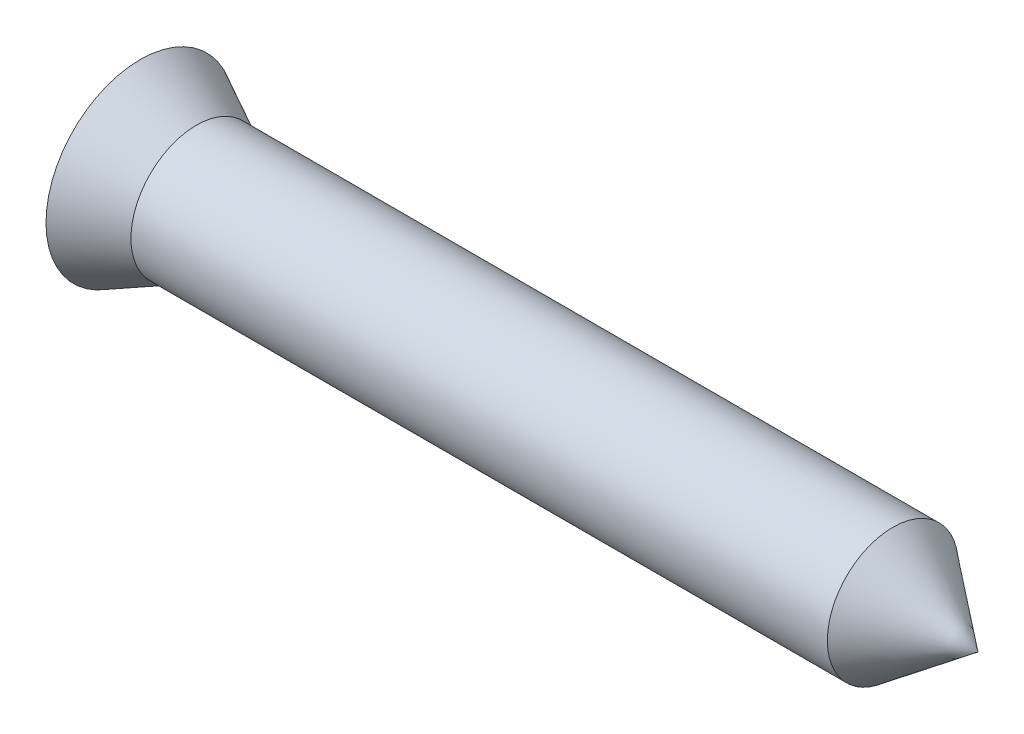
ISO-10303-21;
HEADER;
FILE_DESCRIPTION(('STEP AP214'),'2;1');
FILE_NAME('part.step','',(''),(''),'','','');
FILE_SCHEMA(('AUTOMOTIVE_DESIGN { 1 0 10303 214 1 1 1 1 }'));
ENDSEC;
DATA;
#1=APPLICATION_CONTEXT('core data for automotive mechanical design processes');
#2=APPLICATION_PROTOCOL_DEFINITION('international standard','automotive_design',2000,#1);
#3=PRODUCT_CONTEXT('',#1,'mechanical');
#4=PRODUCT('Part','Part','',(#3));
#5=PRODUCT_RELATED_PRODUCT_CATEGORY('part','',(#4));
#6=PRODUCT_DEFINITION_FORMATION('','',#4);
#7=PRODUCT_DEFINITION_CONTEXT('part definition',#1,'design');
#8=PRODUCT_DEFINITION('design','',#6,#7);
#9=PRODUCT_DEFINITION_SHAPE('','',#8);
#10=(LENGTH_UNIT() NAMED_UNIT(*) SI_UNIT(.MILLI.,.METRE.));
#11=(NAMED_UNIT(*) PLANE_ANGLE_UNIT() SI_UNIT($,.RADIAN.));
#12=(NAMED_UNIT(*) SI_UNIT($,.STERADIAN.) SOLID_ANGLE_UNIT());
#13=UNCERTAINTY_MEASURE_WITH_UNIT(LENGTH_MEASURE(1.E-05),#10,'distance_accuracy_value','');
#14=(GEOMETRIC_REPRESENTATION_CONTEXT(3) GLOBAL_UNCERTAINTY_ASSIGNED_CONTEXT((#13)) GLOBAL_UNIT_ASSIGNED_CONTEXT((#10,
#11,#12)) REPRESENTATION_CONTEXT('',''));
#15=CARTESIAN_POINT('',(0.,0.,0.));
#16=DIRECTION('',(0.,0.,1.));
#17=DIRECTION('',(1.,0.,0.));
#18=AXIS2_PLACEMENT_3D('',#15,#16,#17);
#19=CARTESIAN_POINT('',(0.,0.,0.));
#20=DIRECTION('',(-1.,0.,0.));
#21=DIRECTION('',(0.,0.,1.));
#22=AXIS2_PLACEMENT_3D('',#19,#20,#21);
#23=PLANE('',#22);
#24=CARTESIAN_POINT('',(0.,0.,0.));
#25=DIRECTION('',(1.,0.,0.));
#26=DIRECTION('',(0.,0.,-1.));
#27=AXIS2_PLACEMENT_3D('',#24,#25,#26);
#28=CIRCLE('',#27,2.8575);
#29=CARTESIAN_POINT('',(0.,0.,-2.8575));
#30=VERTEX_POINT('',#29);
#31=EDGE_CURVE('E11',#30,#30,#28,.T.);
#32=ORIENTED_EDGE('',*,*,#31,.F.);
#33=EDGE_LOOP('',(#32));
#34=FACE_BOUND('',#33,.T.);
#35=DIRECTION('',(0.,1.,0.));
#36=VECTOR('',#35,1.);
#37=CARTESIAN_POINT('',(0.,-1.90070961649651,-0.510211375025338));
#38=LINE('',#37,#36);
#39=CARTESIAN_POINT('',(0.,-1.90070961649651,-0.510211375025338));
#40=VERTEX_POINT('',#39);
#41=CARTESIAN_POINT('',(0.,-0.526132958545478,-0.510211375025338));
#42=VERTEX_POINT('',#41);
#43=EDGE_CURVE('E210',#40,#42,#38,.T.);
#44=ORIENTED_EDGE('',*,*,#43,.T.);
#45=CARTESIAN_POINT('',(0.,-0.526132958545476,-0.764211375025338));
#46=DIRECTION('',(-1.,0.,0.));
#47=DIRECTION('',(0.,0.,1.));
#48=AXIS2_PLACEMENT_3D('',#45,#46,#47);
#49=CIRCLE('',#48,0.254);
#50=CARTESIAN_POINT('',(0.,-0.272132958545476,-0.76421137502534));
#51=VERTEX_POINT('',#50);
#52=EDGE_CURVE('E48',#42,#51,#49,.T.);
#53=ORIENTED_EDGE('',*,*,#52,.T.);
#54=DIRECTION('',(0.,0.,-1.));
#55=VECTOR('',#54,1.);
#56=CARTESIAN_POINT('',(0.,-0.272132958545476,-0.76421137502534));
#57=LINE('',#56,#55);
#58=CARTESIAN_POINT('',(0.,-0.272132958545476,-1.78737372349218));
#59=VERTEX_POINT('',#58);
#60=EDGE_CURVE('E214',#51,#59,#57,.T.);
#61=ORIENTED_EDGE('',*,*,#60,.T.);
#62=CARTESIAN_POINT('',(0.,-0.018132958545476,-1.78737372349218));
#63=DIRECTION('',(1.,0.,0.));
#64=DIRECTION('',(0.,0.,-1.));
#65=AXIS2_PLACEMENT_3D('',#62,#63,#64);
#66=CIRCLE('',#65,0.254);
#67=CARTESIAN_POINT('',(0.,-0.0181329585454742,-2.04137372349218));
#68=VERTEX_POINT('',#67);
#69=EDGE_CURVE('E573',#59,#68,#66,.T.);
#70=ORIENTED_EDGE('',*,*,#69,.T.);
#71=DIRECTION('',(0.,1.,0.));
#72=VECTOR('',#71,1.);
#73=CARTESIAN_POINT('',(0.,-0.0181329585454742,-2.04137372349218));
#74=LINE('',#73,#72);
#75=CARTESIAN_POINT('',(0.,0.310567778321648,-2.04137372349218));
#76=VERTEX_POINT('',#75);
#77=EDGE_CURVE('E575',#68,#76,#74,.T.);
#78=ORIENTED_EDGE('',*,*,#77,.T.);
#79=CARTESIAN_POINT('',(0.,0.31056777832165,-1.78737372349218));
#80=DIRECTION('',(1.,0.,0.));
#81=DIRECTION('',(0.,0.,1.));
#82=AXIS2_PLACEMENT_3D('',#79,#80,#81);
#83=CIRCLE('',#82,0.254);
#84=CARTESIAN_POINT('',(0.,0.56456777832165,-1.78737372349218));
#85=VERTEX_POINT('',#84);
#86=EDGE_CURVE('E579',#76,#85,#83,.T.);
#87=ORIENTED_EDGE('',*,*,#86,.T.);
#88=DIRECTION('',(0.,0.,1.));
#89=VECTOR('',#88,1.);
#90=CARTESIAN_POINT('',(0.,0.56456777832165,-1.78737372349218));
#91=LINE('',#90,#89);
#92=CARTESIAN_POINT('',(0.,0.56456777832165,-0.680541301338626));
#93=VERTEX_POINT('',#92);
#94=EDGE_CURVE('E586',#85,#93,#91,.T.);
#95=ORIENTED_EDGE('',*,*,#94,.T.);
#96=CARTESIAN_POINT('',(0.,0.81856777832165,-0.680541301338624));
#97=DIRECTION('',(-1.,0.,0.));
#98=DIRECTION('',(0.,0.,1.));
#99=AXIS2_PLACEMENT_3D('',#96,#97,#98);
#100=CIRCLE('',#99,0.254);
#101=CARTESIAN_POINT('',(0.,0.818567778321652,-0.426541301338624));
#102=VERTEX_POINT('',#101);
#103=EDGE_CURVE('E589',#93,#102,#100,.T.);
#104=ORIENTED_EDGE('',*,*,#103,.T.);
#105=DIRECTION('',(0.,1.,0.));
#106=VECTOR('',#105,1.);
#107=CARTESIAN_POINT('',(0.,0.818567778321652,-0.426541301338624));
#108=LINE('',#107,#106);
#109=CARTESIAN_POINT('',(0.,1.82499611205115,-0.426541301338623));
#110=VERTEX_POINT('',#109);
#111=EDGE_CURVE('E592',#102,#110,#108,.T.);
#112=ORIENTED_EDGE('',*,*,#111,.T.);
#113=CARTESIAN_POINT('',(0.,1.82499611205115,-0.172541301338624));
#114=DIRECTION('',(1.,0.,0.));
#115=DIRECTION('',(0.,0.,-1.));
#116=AXIS2_PLACEMENT_3D('',#113,#114,#115);
#117=CIRCLE('',#116,0.254);
#118=CARTESIAN_POINT('',(0.,2.07899611205115,-0.172541301338622));
#119=VERTEX_POINT('',#118);
#120=EDGE_CURVE('E595',#110,#119,#117,.T.);
#121=ORIENTED_EDGE('',*,*,#120,.T.);
#122=DIRECTION('',(0.,0.,1.));
#123=VECTOR('',#122,1.);
#124=CARTESIAN_POINT('',(0.,2.07899611205115,-0.172541301338622));
#125=LINE('',#124,#123);
#126=CARTESIAN_POINT('',(0.,2.07899611205115,0.147792428159828));
#127=VERTEX_POINT('',#126);
#128=EDGE_CURVE('E598',#119,#127,#125,.T.);
#129=ORIENTED_EDGE('',*,*,#128,.T.);
#130=CARTESIAN_POINT('',(0.,1.82499611205115,0.14779242815983));
#131=DIRECTION('',(1.,0.,0.));
#132=DIRECTION('',(0.,0.,-1.));
#133=AXIS2_PLACEMENT_3D('',#130,#131,#132);
#134=CIRCLE('',#133,0.254);
#135=CARTESIAN_POINT('',(0.,1.82499611205115,0.40179242815983));
#136=VERTEX_POINT('',#135);
#137=EDGE_CURVE('E601',#127,#136,#134,.T.);
#138=ORIENTED_EDGE('',*,*,#137,.T.);
#139=DIRECTION('',(0.,-1.,0.));
#140=VECTOR('',#139,1.);
#141=CARTESIAN_POINT('',(0.,1.82499611205115,0.40179242815983));
#142=LINE('',#141,#140);
#143=CARTESIAN_POINT('',(0.,0.818567778321652,0.40179242815983));
#144=VERTEX_POINT('',#143);
#145=EDGE_CURVE('E604',#136,#144,#142,.T.);
#146=ORIENTED_EDGE('',*,*,#145,.T.);
#147=CARTESIAN_POINT('',(0.,0.81856777832165,0.65579242815983));
#148=DIRECTION('',(-1.,0.,0.));
#149=DIRECTION('',(0.,0.,1.));
#150=AXIS2_PLACEMENT_3D('',#147,#148,#149);
#151=CIRCLE('',#150,0.254);
#152=CARTESIAN_POINT('',(0.,0.56456777832165,0.655792428159831));
#153=VERTEX_POINT('',#152);
#154=EDGE_CURVE('E607',#144,#153,#151,.T.);
#155=ORIENTED_EDGE('',*,*,#154,.T.);
#156=DIRECTION('',(0.,0.,1.));
#157=VECTOR('',#156,1.);
#158=CARTESIAN_POINT('',(0.,0.56456777832165,0.655792428159831));
#159=LINE('',#158,#157);
#160=CARTESIAN_POINT('',(0.,0.56456777832165,1.92996499768681));
#161=VERTEX_POINT('',#160);
#162=EDGE_CURVE('E610',#153,#161,#159,.T.);
#163=ORIENTED_EDGE('',*,*,#162,.T.);
#164=CARTESIAN_POINT('',(0.,0.31056777832165,1.92996499768681));
#165=DIRECTION('',(1.,0.,0.));
#166=DIRECTION('',(0.,0.,-1.));
#167=AXIS2_PLACEMENT_3D('',#164,#165,#166);
#168=CIRCLE('',#167,0.254);
#169=CARTESIAN_POINT('',(0.,0.310567778321648,2.18396499768681));
#170=VERTEX_POINT('',#169);
#171=EDGE_CURVE('E613',#161,#170,#168,.T.);
#172=ORIENTED_EDGE('',*,*,#171,.T.);
#173=DIRECTION('',(0.,-1.,0.));
#174=VECTOR('',#173,1.);
#175=CARTESIAN_POINT('',(0.,0.310567778321648,2.18396499768681));
#176=LINE('',#175,#174);
#177=CARTESIAN_POINT('',(0.,-0.0022942148429667,2.18396499768681));
#178=VERTEX_POINT('',#177);
#179=EDGE_CURVE('E616',#170,#178,#176,.T.);
#180=ORIENTED_EDGE('',*,*,#179,.T.);
#181=CARTESIAN_POINT('',(0.,-0.00229421484296673,1.92996499768681));
#182=DIRECTION('',(1.,0.,0.));
#183=DIRECTION('',(0.,0.,-1.));
#184=AXIS2_PLACEMENT_3D('',#181,#182,#183);
#185=CIRCLE('',#184,0.254);
#186=CARTESIAN_POINT('',(0.,-0.256294214842967,1.92996499768681));
#187=VERTEX_POINT('',#186);
#188=EDGE_CURVE('E619',#178,#187,#185,.T.);
#189=ORIENTED_EDGE('',*,*,#188,.T.);
#190=DIRECTION('',(0.,0.,-1.));
#191=VECTOR('',#190,1.);
#192=CARTESIAN_POINT('',(0.,-0.256294214842967,1.92996499768681));
#193=LINE('',#192,#191);
#194=CARTESIAN_POINT('',(0.,-0.256294214842967,0.65579242815983));
#195=VERTEX_POINT('',#194);
#196=EDGE_CURVE('E622',#187,#195,#193,.T.);
#197=ORIENTED_EDGE('',*,*,#196,.T.);
#198=CARTESIAN_POINT('',(0.,-0.510294214842967,0.65579242815983));
#199=DIRECTION('',(-1.,0.,0.));
#200=DIRECTION('',(0.,0.,1.));
#201=AXIS2_PLACEMENT_3D('',#198,#199,#200);
#202=CIRCLE('',#201,0.254);
#203=CARTESIAN_POINT('',(0.,-0.510294214842967,0.40179242815983));
#204=VERTEX_POINT('',#203);
#205=EDGE_CURVE('E625',#195,#204,#202,.T.);
#206=ORIENTED_EDGE('',*,*,#205,.T.);
#207=DIRECTION('',(0.,-1.,0.));
#208=VECTOR('',#207,1.);
#209=CARTESIAN_POINT('',(0.,-0.510294214842967,0.40179242815983));
#210=LINE('',#209,#208);
#211=CARTESIAN_POINT('',(0.,-1.90070961649651,0.40179242815983));
#212=VERTEX_POINT('',#211);
#213=EDGE_CURVE('E628',#204,#212,#210,.T.);
#214=ORIENTED_EDGE('',*,*,#213,.T.);
#215=CARTESIAN_POINT('',(0.,-1.90070961649651,0.14779242815983));
#216=DIRECTION('',(1.,0.,0.));
#217=DIRECTION('',(0.,0.,-1.));
#218=AXIS2_PLACEMENT_3D('',#215,#216,#217);
#219=CIRCLE('',#218,0.254);
#220=CARTESIAN_POINT('',(0.,-2.15470961649651,0.147792428159828));
#221=VERTEX_POINT('',#220);
#222=EDGE_CURVE('E525',#212,#221,#219,.T.);
#223=ORIENTED_EDGE('',*,*,#222,.T.);
#224=DIRECTION('',(0.,0.,-1.));
#225=VECTOR('',#224,1.);
#226=CARTESIAN_POINT('',(0.,-2.15470961649651,0.147792428159828));
#227=LINE('',#226,#225);
#228=CARTESIAN_POINT('',(0.,-2.15470961649651,-0.256211375025336));
#229=VERTEX_POINT('',#228);
#230=EDGE_CURVE('E522',#221,#229,#227,.T.);
#231=ORIENTED_EDGE('',*,*,#230,.T.);
#232=CARTESIAN_POINT('',(0.,-1.90070961649651,-0.256211375025338));
#233=DIRECTION('',(1.,0.,0.));
#234=DIRECTION('',(0.,0.,-1.));
#235=AXIS2_PLACEMENT_3D('',#232,#233,#234);
#236=CIRCLE('',#235,0.254000000000001);
#237=EDGE_CURVE('E516',#229,#40,#236,.T.);
#238=ORIENTED_EDGE('',*,*,#237,.T.);
#239=EDGE_LOOP('',(#44,#53,#61,#70,#78,#87,#95,#104,#112,#121,#129,#138,#146,#155,#163,#172,
#180,#189,#197,#206,#214,#223,#231,#238));
#240=FACE_BOUND('',#239,.T.);
#241=ADVANCED_FACE('F34',(#34,#240),#23,.T.);
#242=CARTESIAN_POINT('',(1.7018,0.,0.));
#243=DIRECTION('',(-1.,0.,0.));
#244=DIRECTION('',(0.,0.,1.));
#245=AXIS2_PLACEMENT_3D('',#242,#243,#244);
#246=CONICAL_SURFACE('',#245,1.984375,0.474040701740187);
#247=ORIENTED_EDGE('',*,*,#31,.T.);
#248=EDGE_LOOP('',(#247));
#249=FACE_BOUND('',#248,.T.);
#250=CARTESIAN_POINT('',(1.7018,0.,0.));
#251=DIRECTION('',(1.,0.,0.));
#252=DIRECTION('',(0.,0.,-1.));
#253=AXIS2_PLACEMENT_3D('',#250,#251,#252);
#254=CIRCLE('',#253,1.984375);
#255=CARTESIAN_POINT('',(1.7018,0.,-1.984375));
#256=VERTEX_POINT('',#255);
#257=EDGE_CURVE('E41',#256,#256,#254,.T.);
#258=ORIENTED_EDGE('',*,*,#257,.F.);
#259=EDGE_LOOP('',(#258));
#260=FACE_BOUND('',#259,.T.);
#261=ADVANCED_FACE('F229',(#249,#260),#246,.T.);
#262=CARTESIAN_POINT('',(25.4,0.,0.));
#263=DIRECTION('',(1.,0.,0.));
#264=DIRECTION('',(0.,0.,-1.));
#265=AXIS2_PLACEMENT_3D('',#262,#263,#264);
#266=CYLINDRICAL_SURFACE('',#265,1.984375);
#267=ORIENTED_EDGE('',*,*,#257,.T.);
#268=EDGE_LOOP('',(#267));
#269=FACE_BOUND('',#268,.T.);
#270=CARTESIAN_POINT('',(22.8172803654431,0.,0.));
#271=DIRECTION('',(1.,0.,0.));
#272=DIRECTION('',(0.,0.,-1.));
#273=AXIS2_PLACEMENT_3D('',#270,#271,#272);
#274=CIRCLE('',#273,1.984375);
#275=CARTESIAN_POINT('',(22.8172803654431,0.,-1.984375));
#276=VERTEX_POINT('',#275);
#277=EDGE_CURVE('E215',#276,#276,#274,.T.);
#278=ORIENTED_EDGE('',*,*,#277,.F.);
#279=EDGE_LOOP('',(#278));
#280=FACE_BOUND('',#279,.T.);
#281=ADVANCED_FACE('F226',(#269,#280),#266,.T.);
#282=CARTESIAN_POINT('',(25.4,0.,0.));
#283=DIRECTION('',(-1.,0.,0.));
#284=DIRECTION('',(0.,0.,1.));
#285=AXIS2_PLACEMENT_3D('',#282,#283,#284);
#286=CONICAL_SURFACE('',#285,0.,0.655128013920601);
#287=ORIENTED_EDGE('',*,*,#277,.T.);
#288=EDGE_LOOP('',(#287));
#289=FACE_BOUND('',#288,.T.);
#290=CARTESIAN_POINT('',(25.4,0.,0.));
#291=VERTEX_POINT('',#290);
#292=VERTEX_LOOP('',#291);
#293=FACE_BOUND('',#292,.T.);
#294=ADVANCED_FACE('F236',(#289,#293),#286,.T.);
#295=CARTESIAN_POINT('',(0.254,-0.526132958545476,-0.764211375025338));
#296=DIRECTION('',(-1.,0.,0.));
#297=DIRECTION('',(0.,0.,1.));
#298=AXIS2_PLACEMENT_3D('',#295,#296,#297);
#299=CYLINDRICAL_SURFACE('',#298,0.254);
#300=ORIENTED_EDGE('',*,*,#52,.F.);
#301=DIRECTION('',(-1.,0.,0.));
#302=VECTOR('',#301,1.);
#303=CARTESIAN_POINT('',(0.254,-0.526132958545478,-0.510211375025338));
#304=LINE('',#303,#302);
#305=CARTESIAN_POINT('',(0.254,-0.526132958545478,-0.510211375025338));
#306=VERTEX_POINT('',#305);
#307=EDGE_CURVE('E209',#306,#42,#304,.T.);
#308=ORIENTED_EDGE('',*,*,#307,.F.);
#309=CARTESIAN_POINT('',(0.254,-0.526132958545476,-0.764211375025338));
#310=DIRECTION('',(-1.,0.,0.));
#311=DIRECTION('',(0.,0.,1.));
#312=AXIS2_PLACEMENT_3D('',#309,#310,#311);
#313=CIRCLE('',#312,0.254);
#314=CARTESIAN_POINT('',(0.254,-0.272132958545476,-0.76421137502534));
#315=VERTEX_POINT('',#314);
#316=EDGE_CURVE('E200',#306,#315,#313,.T.);
#317=ORIENTED_EDGE('',*,*,#316,.T.);
#318=DIRECTION('',(-1.,0.,0.));
#319=VECTOR('',#318,1.);
#320=CARTESIAN_POINT('',(0.254,-0.272132958545476,-0.76421137502534));
#321=LINE('',#320,#319);
#322=EDGE_CURVE('E208',#315,#51,#321,.T.);
#323=ORIENTED_EDGE('',*,*,#322,.T.);
#324=EDGE_LOOP('',(#300,#308,#317,#323));
#325=FACE_BOUND('',#324,.T.);
#326=ADVANCED_FACE('F207',(#325),#299,.T.);
#327=CARTESIAN_POINT('',(0.254,-0.272132958545476,-0.76421137502534));
#328=DIRECTION('',(0.,1.,0.));
#329=DIRECTION('',(0.,0.,1.));
#330=AXIS2_PLACEMENT_3D('',#327,#328,#329);
#331=PLANE('',#330);
#332=ORIENTED_EDGE('',*,*,#60,.F.);
#333=ORIENTED_EDGE('',*,*,#322,.F.);
#334=DIRECTION('',(0.,0.,-1.));
#335=VECTOR('',#334,1.);
#336=CARTESIAN_POINT('',(0.254,-0.272132958545476,-0.76421137502534));
#337=LINE('',#336,#335);
#338=CARTESIAN_POINT('',(0.254,-0.272132958545476,-1.78737372349218));
#339=VERTEX_POINT('',#338);
#340=EDGE_CURVE('E196',#315,#339,#337,.T.);
#341=ORIENTED_EDGE('',*,*,#340,.T.);
#342=DIRECTION('',(-1.,0.,0.));
#343=VECTOR('',#342,1.);
#344=CARTESIAN_POINT('',(0.254,-0.272132958545476,-1.78737372349218));
#345=LINE('',#344,#343);
#346=EDGE_CURVE('E216',#339,#59,#345,.T.);
#347=ORIENTED_EDGE('',*,*,#346,.T.);
#348=EDGE_LOOP('',(#332,#333,#341,#347));
#349=FACE_BOUND('',#348,.T.);
#350=ADVANCED_FACE('F212',(#349),#331,.T.);
#351=CARTESIAN_POINT('',(0.254,-0.018132958545476,-1.78737372349218));
#352=DIRECTION('',(-1.,0.,0.));
#353=DIRECTION('',(0.,0.,1.));
#354=AXIS2_PLACEMENT_3D('',#351,#352,#353);
#355=CYLINDRICAL_SURFACE('',#354,0.254);
#356=ORIENTED_EDGE('',*,*,#69,.F.);
#357=ORIENTED_EDGE('',*,*,#346,.F.);
#358=CARTESIAN_POINT('',(0.254,-0.018132958545476,-1.78737372349218));
#359=DIRECTION('',(1.,0.,0.));
#360=DIRECTION('',(0.,0.,-1.));
#361=AXIS2_PLACEMENT_3D('',#358,#359,#360);
#362=CIRCLE('',#361,0.254);
#363=CARTESIAN_POINT('',(0.254,-0.0181329585454742,-2.04137372349218));
#364=VERTEX_POINT('',#363);
#365=EDGE_CURVE('E202',#339,#364,#362,.T.);
#366=ORIENTED_EDGE('',*,*,#365,.T.);
#367=DIRECTION('',(-1.,0.,0.));
#368=VECTOR('',#367,1.);
#369=CARTESIAN_POINT('',(0.254,-0.0181329585454742,-2.04137372349218));
#370=LINE('',#369,#368);
#371=EDGE_CURVE('E220',#364,#68,#370,.T.);
#372=ORIENTED_EDGE('',*,*,#371,.T.);
#373=EDGE_LOOP('',(#356,#357,#366,#372));
#374=FACE_BOUND('',#373,.T.);
#375=ADVANCED_FACE('F247',(#374),#355,.F.);
#376=CARTESIAN_POINT('',(0.254,-0.0181329585454742,-2.04137372349218));
#377=DIRECTION('',(0.,0.,1.));
#378=DIRECTION('',(1.,0.,0.));
#379=AXIS2_PLACEMENT_3D('',#376,#377,#378);
#380=PLANE('',#379);
#381=ORIENTED_EDGE('',*,*,#77,.F.);
#382=ORIENTED_EDGE('',*,*,#371,.F.);
#383=DIRECTION('',(0.,1.,0.));
#384=VECTOR('',#383,1.);
#385=CARTESIAN_POINT('',(0.254,-0.0181329585454742,-2.04137372349218));
#386=LINE('',#385,#384);
#387=CARTESIAN_POINT('',(0.254,0.310567778321648,-2.04137372349218));
#388=VERTEX_POINT('',#387);
#389=EDGE_CURVE('E677',#364,#388,#386,.T.);
#390=ORIENTED_EDGE('',*,*,#389,.T.);
#391=DIRECTION('',(-1.,0.,0.));
#392=VECTOR('',#391,1.);
#393=CARTESIAN_POINT('',(0.254,0.310567778321648,-2.04137372349218));
#394=LINE('',#393,#392);
#395=EDGE_CURVE('E568',#388,#76,#394,.T.);
#396=ORIENTED_EDGE('',*,*,#395,.T.);
#397=EDGE_LOOP('',(#381,#382,#390,#396));
#398=FACE_BOUND('',#397,.T.);
#399=ADVANCED_FACE('F250',(#398),#380,.T.);
#400=CARTESIAN_POINT('',(0.254,0.31056777832165,-1.78737372349218));
#401=DIRECTION('',(-1.,0.,0.));
#402=DIRECTION('',(0.,0.,1.));
#403=AXIS2_PLACEMENT_3D('',#400,#401,#402);
#404=CYLINDRICAL_SURFACE('',#403,0.254);
#405=ORIENTED_EDGE('',*,*,#86,.F.);
#406=ORIENTED_EDGE('',*,*,#395,.F.);
#407=CARTESIAN_POINT('',(0.254,0.31056777832165,-1.78737372349218));
#408=DIRECTION('',(1.,0.,0.));
#409=DIRECTION('',(0.,0.,1.));
#410=AXIS2_PLACEMENT_3D('',#407,#408,#409);
#411=CIRCLE('',#410,0.254);
#412=CARTESIAN_POINT('',(0.254,0.56456777832165,-1.78737372349218));
#413=VERTEX_POINT('',#412);
#414=EDGE_CURVE('E675',#388,#413,#411,.T.);
#415=ORIENTED_EDGE('',*,*,#414,.T.);
#416=DIRECTION('',(-1.,0.,0.));
#417=VECTOR('',#416,1.);
#418=CARTESIAN_POINT('',(0.254,0.56456777832165,-1.78737372349218));
#419=LINE('',#418,#417);
#420=EDGE_CURVE('E566',#413,#85,#419,.T.);
#421=ORIENTED_EDGE('',*,*,#420,.T.);
#422=EDGE_LOOP('',(#405,#406,#415,#421));
#423=FACE_BOUND('',#422,.T.);
#424=ADVANCED_FACE('F254',(#423),#404,.F.);
#425=CARTESIAN_POINT('',(0.254,0.56456777832165,-1.78737372349218));
#426=DIRECTION('',(0.,-1.,0.));
#427=DIRECTION('',(0.,0.,-1.));
#428=AXIS2_PLACEMENT_3D('',#425,#426,#427);
#429=PLANE('',#428);
#430=ORIENTED_EDGE('',*,*,#94,.F.);
#431=ORIENTED_EDGE('',*,*,#420,.F.);
#432=DIRECTION('',(0.,0.,1.));
#433=VECTOR('',#432,1.);
#434=CARTESIAN_POINT('',(0.254,0.56456777832165,-1.78737372349218));
#435=LINE('',#434,#433);
#436=CARTESIAN_POINT('',(0.254,0.56456777832165,-0.680541301338626));
#437=VERTEX_POINT('',#436);
#438=EDGE_CURVE('E673',#413,#437,#435,.T.);
#439=ORIENTED_EDGE('',*,*,#438,.T.);
#440=DIRECTION('',(-1.,0.,0.));
#441=VECTOR('',#440,1.);
#442=CARTESIAN_POINT('',(0.254,0.56456777832165,-0.680541301338626));
#443=LINE('',#442,#441);
#444=EDGE_CURVE('E564',#437,#93,#443,.T.);
#445=ORIENTED_EDGE('',*,*,#444,.T.);
#446=EDGE_LOOP('',(#430,#431,#439,#445));
#447=FACE_BOUND('',#446,.T.);
#448=ADVANCED_FACE('F258',(#447),#429,.T.);
#449=CARTESIAN_POINT('',(0.254,0.81856777832165,-0.680541301338624));
#450=DIRECTION('',(-1.,0.,0.));
#451=DIRECTION('',(0.,0.,1.));
#452=AXIS2_PLACEMENT_3D('',#449,#450,#451);
#453=CYLINDRICAL_SURFACE('',#452,0.254);
#454=ORIENTED_EDGE('',*,*,#103,.F.);
#455=ORIENTED_EDGE('',*,*,#444,.F.);
#456=CARTESIAN_POINT('',(0.254,0.81856777832165,-0.680541301338624));
#457=DIRECTION('',(-1.,0.,0.));
#458=DIRECTION('',(0.,0.,1.));
#459=AXIS2_PLACEMENT_3D('',#456,#457,#458);
#460=CIRCLE('',#459,0.254);
#461=CARTESIAN_POINT('',(0.254,0.818567778321652,-0.426541301338624));
#462=VERTEX_POINT('',#461);
#463=EDGE_CURVE('E671',#437,#462,#460,.T.);
#464=ORIENTED_EDGE('',*,*,#463,.T.);
#465=DIRECTION('',(-1.,0.,0.));
#466=VECTOR('',#465,1.);
#467=CARTESIAN_POINT('',(0.254,0.818567778321652,-0.426541301338624));
#468=LINE('',#467,#466);
#469=EDGE_CURVE('E562',#462,#102,#468,.T.);
#470=ORIENTED_EDGE('',*,*,#469,.T.);
#471=EDGE_LOOP('',(#454,#455,#464,#470));
#472=FACE_BOUND('',#471,.T.);
#473=ADVANCED_FACE('F262',(#472),#453,.T.);
#474=CARTESIAN_POINT('',(0.254,0.818567778321652,-0.426541301338624));
#475=DIRECTION('',(0.,0.,1.));
#476=DIRECTION('',(1.,0.,0.));
#477=AXIS2_PLACEMENT_3D('',#474,#475,#476);
#478=PLANE('',#477);
#479=ORIENTED_EDGE('',*,*,#111,.F.);
#480=ORIENTED_EDGE('',*,*,#469,.F.);
#481=DIRECTION('',(0.,1.,0.));
#482=VECTOR('',#481,1.);
#483=CARTESIAN_POINT('',(0.254,0.818567778321652,-0.426541301338624));
#484=LINE('',#483,#482);
#485=CARTESIAN_POINT('',(0.254,1.82499611205115,-0.426541301338623));
#486=VERTEX_POINT('',#485);
#487=EDGE_CURVE('E669',#462,#486,#484,.T.);
#488=ORIENTED_EDGE('',*,*,#487,.T.);
#489=DIRECTION('',(-1.,0.,0.));
#490=VECTOR('',#489,1.);
#491=CARTESIAN_POINT('',(0.254,1.82499611205115,-0.426541301338623));
#492=LINE('',#491,#490);
#493=EDGE_CURVE('E560',#486,#110,#492,.T.);
#494=ORIENTED_EDGE('',*,*,#493,.T.);
#495=EDGE_LOOP('',(#479,#480,#488,#494));
#496=FACE_BOUND('',#495,.T.);
#497=ADVANCED_FACE('F266',(#496),#478,.T.);
#498=CARTESIAN_POINT('',(0.254,1.82499611205115,-0.172541301338624));
#499=DIRECTION('',(-1.,0.,0.));
#500=DIRECTION('',(0.,0.,1.));
#501=AXIS2_PLACEMENT_3D('',#498,#499,#500);
#502=CYLINDRICAL_SURFACE('',#501,0.254);
#503=ORIENTED_EDGE('',*,*,#120,.F.);
#504=ORIENTED_EDGE('',*,*,#493,.F.);
#505=CARTESIAN_POINT('',(0.254,1.82499611205115,-0.172541301338624));
#506=DIRECTION('',(1.,0.,0.));
#507=DIRECTION('',(0.,0.,-1.));
#508=AXIS2_PLACEMENT_3D('',#505,#506,#507);
#509=CIRCLE('',#508,0.254);
#510=CARTESIAN_POINT('',(0.254,2.07899611205115,-0.172541301338622));
#511=VERTEX_POINT('',#510);
#512=EDGE_CURVE('E667',#486,#511,#509,.T.);
#513=ORIENTED_EDGE('',*,*,#512,.T.);
#514=DIRECTION('',(-1.,0.,0.));
#515=VECTOR('',#514,1.);
#516=CARTESIAN_POINT('',(0.254,2.07899611205115,-0.172541301338622));
#517=LINE('',#516,#515);
#518=EDGE_CURVE('E558',#511,#119,#517,.T.);
#519=ORIENTED_EDGE('',*,*,#518,.T.);
#520=EDGE_LOOP('',(#503,#504,#513,#519));
#521=FACE_BOUND('',#520,.T.);
#522=ADVANCED_FACE('F270',(#521),#502,.F.);
#523=CARTESIAN_POINT('',(0.254,2.07899611205115,-0.172541301338622));
#524=DIRECTION('',(0.,-1.,0.));
#525=DIRECTION('',(0.,0.,-1.));
#526=AXIS2_PLACEMENT_3D('',#523,#524,#525);
#527=PLANE('',#526);
#528=ORIENTED_EDGE('',*,*,#128,.F.);
#529=ORIENTED_EDGE('',*,*,#518,.F.);
#530=DIRECTION('',(0.,0.,1.));
#531=VECTOR('',#530,1.);
#532=CARTESIAN_POINT('',(0.254,2.07899611205115,-0.172541301338622));
#533=LINE('',#532,#531);
#534=CARTESIAN_POINT('',(0.254,2.07899611205115,0.147792428159828));
#535=VERTEX_POINT('',#534);
#536=EDGE_CURVE('E665',#511,#535,#533,.T.);
#537=ORIENTED_EDGE('',*,*,#536,.T.);
#538=DIRECTION('',(-1.,0.,0.));
#539=VECTOR('',#538,1.);
#540=CARTESIAN_POINT('',(0.254,2.07899611205115,0.147792428159828));
#541=LINE('',#540,#539);
#542=EDGE_CURVE('E556',#535,#127,#541,.T.);
#543=ORIENTED_EDGE('',*,*,#542,.T.);
#544=EDGE_LOOP('',(#528,#529,#537,#543));
#545=FACE_BOUND('',#544,.T.);
#546=ADVANCED_FACE('F274',(#545),#527,.T.);
#547=CARTESIAN_POINT('',(0.254,1.82499611205115,0.14779242815983));
#548=DIRECTION('',(-1.,0.,0.));
#549=DIRECTION('',(0.,0.,1.));
#550=AXIS2_PLACEMENT_3D('',#547,#548,#549);
#551=CYLINDRICAL_SURFACE('',#550,0.254);
#552=ORIENTED_EDGE('',*,*,#137,.F.);
#553=ORIENTED_EDGE('',*,*,#542,.F.);
#554=CARTESIAN_POINT('',(0.254,1.82499611205115,0.14779242815983));
#555=DIRECTION('',(1.,0.,0.));
#556=DIRECTION('',(0.,0.,-1.));
#557=AXIS2_PLACEMENT_3D('',#554,#555,#556);
#558=CIRCLE('',#557,0.254);
#559=CARTESIAN_POINT('',(0.254,1.82499611205115,0.40179242815983));
#560=VERTEX_POINT('',#559);
#561=EDGE_CURVE('E663',#535,#560,#558,.T.);
#562=ORIENTED_EDGE('',*,*,#561,.T.);
#563=DIRECTION('',(-1.,0.,0.));
#564=VECTOR('',#563,1.);
#565=CARTESIAN_POINT('',(0.254,1.82499611205115,0.40179242815983));
#566=LINE('',#565,#564);
#567=EDGE_CURVE('E554',#560,#136,#566,.T.);
#568=ORIENTED_EDGE('',*,*,#567,.T.);
#569=EDGE_LOOP('',(#552,#553,#562,#568));
#570=FACE_BOUND('',#569,.T.);
#571=ADVANCED_FACE('F278',(#570),#551,.F.);
#572=CARTESIAN_POINT('',(0.254,1.82499611205115,0.40179242815983));
#573=DIRECTION('',(0.,0.,-1.));
#574=DIRECTION('',(-1.,0.,0.));
#575=AXIS2_PLACEMENT_3D('',#572,#573,#574);
#576=PLANE('',#575);
#577=ORIENTED_EDGE('',*,*,#145,.F.);
#578=ORIENTED_EDGE('',*,*,#567,.F.);
#579=DIRECTION('',(0.,-1.,0.));
#580=VECTOR('',#579,1.);
#581=CARTESIAN_POINT('',(0.254,1.82499611205115,0.40179242815983));
#582=LINE('',#581,#580);
#583=CARTESIAN_POINT('',(0.254,0.818567778321652,0.40179242815983));
#584=VERTEX_POINT('',#583);
#585=EDGE_CURVE('E661',#560,#584,#582,.T.);
#586=ORIENTED_EDGE('',*,*,#585,.T.);
#587=DIRECTION('',(-1.,0.,0.));
#588=VECTOR('',#587,1.);
#589=CARTESIAN_POINT('',(0.254,0.818567778321652,0.40179242815983));
#590=LINE('',#589,#588);
#591=EDGE_CURVE('E552',#584,#144,#590,.T.);
#592=ORIENTED_EDGE('',*,*,#591,.T.);
#593=EDGE_LOOP('',(#577,#578,#586,#592));
#594=FACE_BOUND('',#593,.T.);
#595=ADVANCED_FACE('F282',(#594),#576,.T.);
#596=CARTESIAN_POINT('',(0.254,0.81856777832165,0.65579242815983));
#597=DIRECTION('',(-1.,0.,0.));
#598=DIRECTION('',(0.,0.,1.));
#599=AXIS2_PLACEMENT_3D('',#596,#597,#598);
#600=CYLINDRICAL_SURFACE('',#599,0.254);
#601=ORIENTED_EDGE('',*,*,#154,.F.);
#602=ORIENTED_EDGE('',*,*,#591,.F.);
#603=CARTESIAN_POINT('',(0.254,0.81856777832165,0.65579242815983));
#604=DIRECTION('',(-1.,0.,0.));
#605=DIRECTION('',(0.,0.,1.));
#606=AXIS2_PLACEMENT_3D('',#603,#604,#605);
#607=CIRCLE('',#606,0.254);
#608=CARTESIAN_POINT('',(0.254,0.56456777832165,0.655792428159831));
#609=VERTEX_POINT('',#608);
#610=EDGE_CURVE('E659',#584,#609,#607,.T.);
#611=ORIENTED_EDGE('',*,*,#610,.T.);
#612=DIRECTION('',(-1.,0.,0.));
#613=VECTOR('',#612,1.);
#614=CARTESIAN_POINT('',(0.254,0.56456777832165,0.655792428159831));
#615=LINE('',#614,#613);
#616=EDGE_CURVE('E550',#609,#153,#615,.T.);
#617=ORIENTED_EDGE('',*,*,#616,.T.);
#618=EDGE_LOOP('',(#601,#602,#611,#617));
#619=FACE_BOUND('',#618,.T.);
#620=ADVANCED_FACE('F286',(#619),#600,.T.);
#621=CARTESIAN_POINT('',(0.254,0.56456777832165,0.655792428159831));
#622=DIRECTION('',(0.,-1.,0.));
#623=DIRECTION('',(0.,0.,-1.));
#624=AXIS2_PLACEMENT_3D('',#621,#622,#623);
#625=PLANE('',#624);
#626=ORIENTED_EDGE('',*,*,#162,.F.);
#627=ORIENTED_EDGE('',*,*,#616,.F.);
#628=DIRECTION('',(0.,0.,1.));
#629=VECTOR('',#628,1.);
#630=CARTESIAN_POINT('',(0.254,0.56456777832165,0.655792428159831));
#631=LINE('',#630,#629);
#632=CARTESIAN_POINT('',(0.254,0.56456777832165,1.92996499768681));
#633=VERTEX_POINT('',#632);
#634=EDGE_CURVE('E657',#609,#633,#631,.T.);
#635=ORIENTED_EDGE('',*,*,#634,.T.);
#636=DIRECTION('',(-1.,0.,0.));
#637=VECTOR('',#636,1.);
#638=CARTESIAN_POINT('',(0.254,0.56456777832165,1.92996499768681));
#639=LINE('',#638,#637);
#640=EDGE_CURVE('E548',#633,#161,#639,.T.);
#641=ORIENTED_EDGE('',*,*,#640,.T.);
#642=EDGE_LOOP('',(#626,#627,#635,#641));
#643=FACE_BOUND('',#642,.T.);
#644=ADVANCED_FACE('F290',(#643),#625,.T.);
#645=CARTESIAN_POINT('',(0.254,0.31056777832165,1.92996499768681));
#646=DIRECTION('',(-1.,0.,0.));
#647=DIRECTION('',(0.,0.,1.));
#648=AXIS2_PLACEMENT_3D('',#645,#646,#647);
#649=CYLINDRICAL_SURFACE('',#648,0.254);
#650=ORIENTED_EDGE('',*,*,#171,.F.);
#651=ORIENTED_EDGE('',*,*,#640,.F.);
#652=CARTESIAN_POINT('',(0.254,0.31056777832165,1.92996499768681));
#653=DIRECTION('',(1.,0.,0.));
#654=DIRECTION('',(0.,0.,-1.));
#655=AXIS2_PLACEMENT_3D('',#652,#653,#654);
#656=CIRCLE('',#655,0.254);
#657=CARTESIAN_POINT('',(0.254,0.310567778321648,2.18396499768681));
#658=VERTEX_POINT('',#657);
#659=EDGE_CURVE('E655',#633,#658,#656,.T.);
#660=ORIENTED_EDGE('',*,*,#659,.T.);
#661=DIRECTION('',(-1.,0.,0.));
#662=VECTOR('',#661,1.);
#663=CARTESIAN_POINT('',(0.254,0.310567778321648,2.18396499768681));
#664=LINE('',#663,#662);
#665=EDGE_CURVE('E546',#658,#170,#664,.T.);
#666=ORIENTED_EDGE('',*,*,#665,.T.);
#667=EDGE_LOOP('',(#650,#651,#660,#666));
#668=FACE_BOUND('',#667,.T.);
#669=ADVANCED_FACE('F294',(#668),#649,.F.);
#670=CARTESIAN_POINT('',(0.254,0.310567778321648,2.18396499768681));
#671=DIRECTION('',(0.,0.,-1.));
#672=DIRECTION('',(-1.,0.,0.));
#673=AXIS2_PLACEMENT_3D('',#670,#671,#672);
#674=PLANE('',#673);
#675=ORIENTED_EDGE('',*,*,#179,.F.);
#676=ORIENTED_EDGE('',*,*,#665,.F.);
#677=DIRECTION('',(0.,-1.,0.));
#678=VECTOR('',#677,1.);
#679=CARTESIAN_POINT('',(0.254,0.310567778321648,2.18396499768681));
#680=LINE('',#679,#678);
#681=CARTESIAN_POINT('',(0.254,-0.0022942148429667,2.18396499768681));
#682=VERTEX_POINT('',#681);
#683=EDGE_CURVE('E653',#658,#682,#680,.T.);
#684=ORIENTED_EDGE('',*,*,#683,.T.);
#685=DIRECTION('',(-1.,0.,0.));
#686=VECTOR('',#685,1.);
#687=CARTESIAN_POINT('',(0.254,-0.0022942148429667,2.18396499768681));
#688=LINE('',#687,#686);
#689=EDGE_CURVE('E544',#682,#178,#688,.T.);
#690=ORIENTED_EDGE('',*,*,#689,.T.);
#691=EDGE_LOOP('',(#675,#676,#684,#690));
#692=FACE_BOUND('',#691,.T.);
#693=ADVANCED_FACE('F298',(#692),#674,.T.);
#694=CARTESIAN_POINT('',(0.254,-0.00229421484296673,1.92996499768681));
#695=DIRECTION('',(-1.,0.,0.));
#696=DIRECTION('',(0.,0.,1.));
#697=AXIS2_PLACEMENT_3D('',#694,#695,#696);
#698=CYLINDRICAL_SURFACE('',#697,0.254);
#699=ORIENTED_EDGE('',*,*,#188,.F.);
#700=ORIENTED_EDGE('',*,*,#689,.F.);
#701=CARTESIAN_POINT('',(0.254,-0.00229421484296673,1.92996499768681));
#702=DIRECTION('',(1.,0.,0.));
#703=DIRECTION('',(0.,0.,-1.));
#704=AXIS2_PLACEMENT_3D('',#701,#702,#703);
#705=CIRCLE('',#704,0.254);
#706=CARTESIAN_POINT('',(0.254,-0.256294214842967,1.92996499768681));
#707=VERTEX_POINT('',#706);
#708=EDGE_CURVE('E651',#682,#707,#705,.T.);
#709=ORIENTED_EDGE('',*,*,#708,.T.);
#710=DIRECTION('',(-1.,0.,0.));
#711=VECTOR('',#710,1.);
#712=CARTESIAN_POINT('',(0.254,-0.256294214842967,1.92996499768681));
#713=LINE('',#712,#711);
#714=EDGE_CURVE('E542',#707,#187,#713,.T.);
#715=ORIENTED_EDGE('',*,*,#714,.T.);
#716=EDGE_LOOP('',(#699,#700,#709,#715));
#717=FACE_BOUND('',#716,.T.);
#718=ADVANCED_FACE('F302',(#717),#698,.F.);
#719=CARTESIAN_POINT('',(0.254,-0.256294214842967,1.92996499768681));
#720=DIRECTION('',(0.,1.,0.));
#721=DIRECTION('',(0.,0.,1.));
#722=AXIS2_PLACEMENT_3D('',#719,#720,#721);
#723=PLANE('',#722);
#724=ORIENTED_EDGE('',*,*,#196,.F.);
#725=ORIENTED_EDGE('',*,*,#714,.F.);
#726=DIRECTION('',(0.,0.,-1.));
#727=VECTOR('',#726,1.);
#728=CARTESIAN_POINT('',(0.254,-0.256294214842967,1.92996499768681));
#729=LINE('',#728,#727);
#730=CARTESIAN_POINT('',(0.254,-0.256294214842967,0.65579242815983));
#731=VERTEX_POINT('',#730);
#732=EDGE_CURVE('E649',#707,#731,#729,.T.);
#733=ORIENTED_EDGE('',*,*,#732,.T.);
#734=DIRECTION('',(-1.,0.,0.));
#735=VECTOR('',#734,1.);
#736=CARTESIAN_POINT('',(0.254,-0.256294214842967,0.65579242815983));
#737=LINE('',#736,#735);
#738=EDGE_CURVE('E540',#731,#195,#737,.T.);
#739=ORIENTED_EDGE('',*,*,#738,.T.);
#740=EDGE_LOOP('',(#724,#725,#733,#739));
#741=FACE_BOUND('',#740,.T.);
#742=ADVANCED_FACE('F306',(#741),#723,.T.);
#743=CARTESIAN_POINT('',(0.254,-0.510294214842967,0.65579242815983));
#744=DIRECTION('',(-1.,0.,0.));
#745=DIRECTION('',(0.,0.,1.));
#746=AXIS2_PLACEMENT_3D('',#743,#744,#745);
#747=CYLINDRICAL_SURFACE('',#746,0.254);
#748=ORIENTED_EDGE('',*,*,#205,.F.);
#749=ORIENTED_EDGE('',*,*,#738,.F.);
#750=CARTESIAN_POINT('',(0.254,-0.510294214842967,0.65579242815983));
#751=DIRECTION('',(-1.,0.,0.));
#752=DIRECTION('',(0.,0.,1.));
#753=AXIS2_PLACEMENT_3D('',#750,#751,#752);
#754=CIRCLE('',#753,0.254);
#755=CARTESIAN_POINT('',(0.254,-0.510294214842967,0.40179242815983));
#756=VERTEX_POINT('',#755);
#757=EDGE_CURVE('E647',#731,#756,#754,.T.);
#758=ORIENTED_EDGE('',*,*,#757,.T.);
#759=DIRECTION('',(-1.,0.,0.));
#760=VECTOR('',#759,1.);
#761=CARTESIAN_POINT('',(0.254,-0.510294214842967,0.40179242815983));
#762=LINE('',#761,#760);
#763=EDGE_CURVE('E538',#756,#204,#762,.T.);
#764=ORIENTED_EDGE('',*,*,#763,.T.);
#765=EDGE_LOOP('',(#748,#749,#758,#764));
#766=FACE_BOUND('',#765,.T.);
#767=ADVANCED_FACE('F310',(#766),#747,.T.);
#768=CARTESIAN_POINT('',(0.254,-0.510294214842967,0.40179242815983));
#769=DIRECTION('',(0.,0.,-1.));
#770=DIRECTION('',(-1.,0.,0.));
#771=AXIS2_PLACEMENT_3D('',#768,#769,#770);
#772=PLANE('',#771);
#773=ORIENTED_EDGE('',*,*,#213,.F.);
#774=ORIENTED_EDGE('',*,*,#763,.F.);
#775=DIRECTION('',(0.,-1.,0.));
#776=VECTOR('',#775,1.);
#777=CARTESIAN_POINT('',(0.254,-0.510294214842967,0.40179242815983));
#778=LINE('',#777,#776);
#779=CARTESIAN_POINT('',(0.254,-1.90070961649651,0.40179242815983));
#780=VERTEX_POINT('',#779);
#781=EDGE_CURVE('E645',#756,#780,#778,.T.);
#782=ORIENTED_EDGE('',*,*,#781,.T.);
#783=DIRECTION('',(-1.,0.,0.));
#784=VECTOR('',#783,1.);
#785=CARTESIAN_POINT('',(0.254,-1.90070961649651,0.40179242815983));
#786=LINE('',#785,#784);
#787=EDGE_CURVE('E536',#780,#212,#786,.T.);
#788=ORIENTED_EDGE('',*,*,#787,.T.);
#789=EDGE_LOOP('',(#773,#774,#782,#788));
#790=FACE_BOUND('',#789,.T.);
#791=ADVANCED_FACE('F314',(#790),#772,.T.);
#792=CARTESIAN_POINT('',(0.254,-1.90070961649651,0.14779242815983));
#793=DIRECTION('',(-1.,0.,0.));
#794=DIRECTION('',(0.,0.,1.));
#795=AXIS2_PLACEMENT_3D('',#792,#793,#794);
#796=CYLINDRICAL_SURFACE('',#795,0.254);
#797=ORIENTED_EDGE('',*,*,#222,.F.);
#798=ORIENTED_EDGE('',*,*,#787,.F.);
#799=CARTESIAN_POINT('',(0.254,-1.90070961649651,0.14779242815983));
#800=DIRECTION('',(1.,0.,0.));
#801=DIRECTION('',(0.,0.,-1.));
#802=AXIS2_PLACEMENT_3D('',#799,#800,#801);
#803=CIRCLE('',#802,0.254);
#804=CARTESIAN_POINT('',(0.254,-2.15470961649651,0.147792428159828));
#805=VERTEX_POINT('',#804);
#806=EDGE_CURVE('E635',#780,#805,#803,.T.);
#807=ORIENTED_EDGE('',*,*,#806,.T.);
#808=DIRECTION('',(-1.,0.,0.));
#809=VECTOR('',#808,1.);
#810=CARTESIAN_POINT('',(0.254,-2.15470961649651,0.147792428159828));
#811=LINE('',#810,#809);
#812=EDGE_CURVE('E534',#805,#221,#811,.T.);
#813=ORIENTED_EDGE('',*,*,#812,.T.);
#814=EDGE_LOOP('',(#797,#798,#807,#813));
#815=FACE_BOUND('',#814,.T.);
#816=ADVANCED_FACE('F318',(#815),#796,.F.);
#817=CARTESIAN_POINT('',(0.254,-2.15470961649651,0.147792428159828));
#818=DIRECTION('',(0.,1.,0.));
#819=DIRECTION('',(0.,0.,1.));
#820=AXIS2_PLACEMENT_3D('',#817,#818,#819);
#821=PLANE('',#820);
#822=ORIENTED_EDGE('',*,*,#230,.F.);
#823=ORIENTED_EDGE('',*,*,#812,.F.);
#824=DIRECTION('',(0.,0.,-1.));
#825=VECTOR('',#824,1.);
#826=CARTESIAN_POINT('',(0.254,-2.15470961649651,0.147792428159828));
#827=LINE('',#826,#825);
#828=CARTESIAN_POINT('',(0.254,-2.15470961649651,-0.256211375025336));
#829=VERTEX_POINT('',#828);
#830=EDGE_CURVE('E637',#805,#829,#827,.T.);
#831=ORIENTED_EDGE('',*,*,#830,.T.);
#832=DIRECTION('',(-1.,0.,0.));
#833=VECTOR('',#832,1.);
#834=CARTESIAN_POINT('',(0.254,-2.15470961649651,-0.256211375025336));
#835=LINE('',#834,#833);
#836=EDGE_CURVE('E532',#829,#229,#835,.T.);
#837=ORIENTED_EDGE('',*,*,#836,.T.);
#838=EDGE_LOOP('',(#822,#823,#831,#837));
#839=FACE_BOUND('',#838,.T.);
#840=ADVANCED_FACE('F322',(#839),#821,.T.);
#841=CARTESIAN_POINT('',(0.254,-1.90070961649651,-0.256211375025338));
#842=DIRECTION('',(-1.,0.,0.));
#843=DIRECTION('',(0.,0.,1.));
#844=AXIS2_PLACEMENT_3D('',#841,#842,#843);
#845=CYLINDRICAL_SURFACE('',#844,0.254000000000001);
#846=ORIENTED_EDGE('',*,*,#237,.F.);
#847=ORIENTED_EDGE('',*,*,#836,.F.);
#848=CARTESIAN_POINT('',(0.254,-1.90070961649651,-0.256211375025338));
#849=DIRECTION('',(1.,0.,0.));
#850=DIRECTION('',(0.,0.,-1.));
#851=AXIS2_PLACEMENT_3D('',#848,#849,#850);
#852=CIRCLE('',#851,0.254000000000001);
#853=CARTESIAN_POINT('',(0.254,-1.90070961649651,-0.510211375025338));
#854=VERTEX_POINT('',#853);
#855=EDGE_CURVE('E639',#829,#854,#852,.T.);
#856=ORIENTED_EDGE('',*,*,#855,.T.);
#857=DIRECTION('',(-1.,0.,0.));
#858=VECTOR('',#857,1.);
#859=CARTESIAN_POINT('',(0.254,-1.90070961649651,-0.510211375025338));
#860=LINE('',#859,#858);
#861=EDGE_CURVE('E514',#854,#40,#860,.T.);
#862=ORIENTED_EDGE('',*,*,#861,.T.);
#863=EDGE_LOOP('',(#846,#847,#856,#862));
#864=FACE_BOUND('',#863,.T.);
#865=ADVANCED_FACE('F326',(#864),#845,.F.);
#866=CARTESIAN_POINT('',(0.254,-1.90070961649651,-0.510211375025338));
#867=DIRECTION('',(0.,0.,1.));
#868=DIRECTION('',(1.,0.,0.));
#869=AXIS2_PLACEMENT_3D('',#866,#867,#868);
#870=PLANE('',#869);
#871=ORIENTED_EDGE('',*,*,#43,.F.);
#872=ORIENTED_EDGE('',*,*,#861,.F.);
#873=DIRECTION('',(0.,1.,0.));
#874=VECTOR('',#873,1.);
#875=CARTESIAN_POINT('',(0.254,-1.90070961649651,-0.510211375025338));
#876=LINE('',#875,#874);
#877=EDGE_CURVE('E530',#854,#306,#876,.T.);
#878=ORIENTED_EDGE('',*,*,#877,.T.);
#879=ORIENTED_EDGE('',*,*,#307,.T.);
#880=EDGE_LOOP('',(#871,#872,#878,#879));
#881=FACE_BOUND('',#880,.T.);
#882=ADVANCED_FACE('F330',(#881),#870,.T.);
#883=CARTESIAN_POINT('',(0.254,-0.526132958545476,-0.764211375025338));
#884=DIRECTION('',(-1.,0.,0.));
#885=DIRECTION('',(0.,0.,1.));
#886=AXIS2_PLACEMENT_3D('',#883,#884,#885);
#887=PLANE('',#886);
#888=ORIENTED_EDGE('',*,*,#316,.F.);
#889=ORIENTED_EDGE('',*,*,#877,.F.);
#890=ORIENTED_EDGE('',*,*,#855,.F.);
#891=ORIENTED_EDGE('',*,*,#830,.F.);
#892=ORIENTED_EDGE('',*,*,#806,.F.);
#893=ORIENTED_EDGE('',*,*,#781,.F.);
#894=ORIENTED_EDGE('',*,*,#757,.F.);
#895=ORIENTED_EDGE('',*,*,#732,.F.);
#896=ORIENTED_EDGE('',*,*,#708,.F.);
#897=ORIENTED_EDGE('',*,*,#683,.F.);
#898=ORIENTED_EDGE('',*,*,#659,.F.);
#899=ORIENTED_EDGE('',*,*,#634,.F.);
#900=ORIENTED_EDGE('',*,*,#610,.F.);
#901=ORIENTED_EDGE('',*,*,#585,.F.);
#902=ORIENTED_EDGE('',*,*,#561,.F.);
#903=ORIENTED_EDGE('',*,*,#536,.F.);
#904=ORIENTED_EDGE('',*,*,#512,.F.);
#905=ORIENTED_EDGE('',*,*,#487,.F.);
#906=ORIENTED_EDGE('',*,*,#463,.F.);
#907=ORIENTED_EDGE('',*,*,#438,.F.);
#908=ORIENTED_EDGE('',*,*,#414,.F.);
#909=ORIENTED_EDGE('',*,*,#389,.F.);
#910=ORIENTED_EDGE('',*,*,#365,.F.);
#911=ORIENTED_EDGE('',*,*,#340,.F.);
#912=EDGE_LOOP('',(#888,#889,#890,#891,#892,#893,#894,#895,#896,#897,#898,#899,#900,#901,#902,
#903,#904,#905,#906,#907,#908,#909,#910,#911));
#913=FACE_BOUND('',#912,.T.);
#914=ADVANCED_FACE('F198',(#913),#887,.T.);
#915=CLOSED_SHELL('',(#241,#261,#281,#294,#326,#350,#375,#399,#424,#448,#473,#497,#522,#546,
#571,#595,#620,#644,#669,#693,#718,#742,#767,#791,#816,#840,#865,#882,#914));
#916=MANIFOLD_SOLID_BREP('B2',#915);
#917=ADVANCED_BREP_SHAPE_REPRESENTATION('',(#18,#916),#14);
#918=SHAPE_DEFINITION_REPRESENTATION(#9,#917);
ENDSEC;
END-ISO-10303-21;
